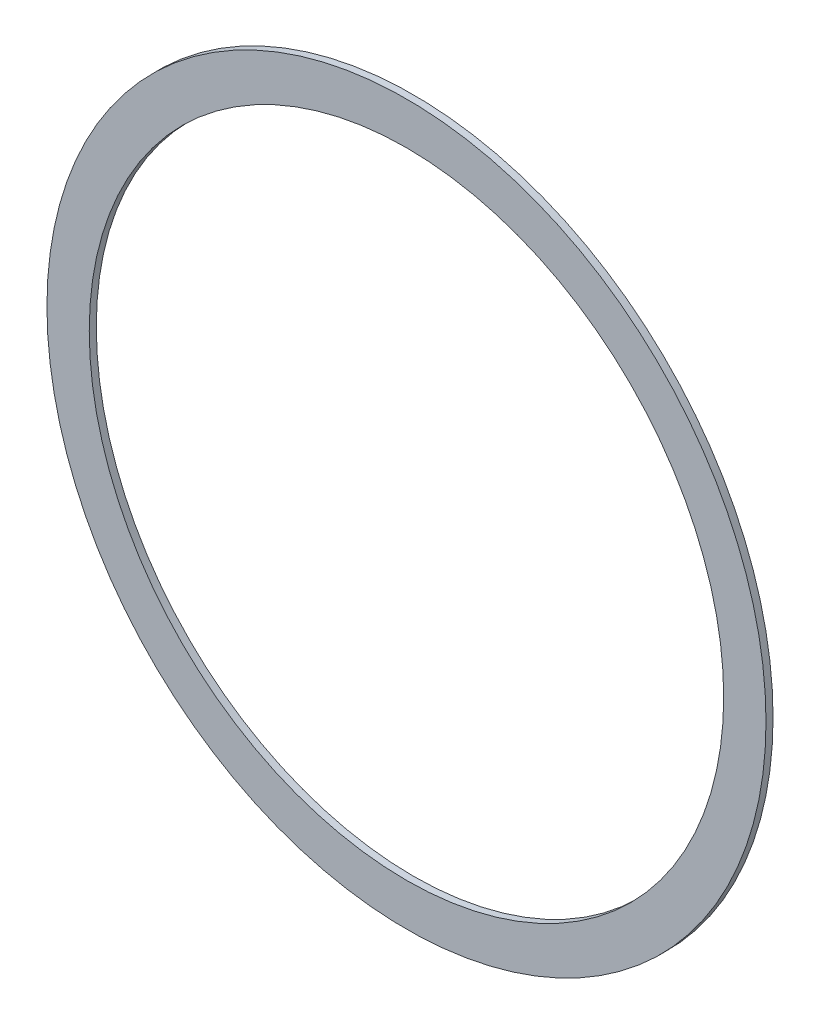
ISO-10303-21;
HEADER;
FILE_DESCRIPTION(('STEP AP214'),'2;1');
FILE_NAME('part.step','',(''),(''),'','','');
FILE_SCHEMA(('AUTOMOTIVE_DESIGN { 1 0 10303 214 1 1 1 1 }'));
ENDSEC;
DATA;
#1=APPLICATION_CONTEXT('core data for automotive mechanical design processes');
#2=APPLICATION_PROTOCOL_DEFINITION('international standard','automotive_design',2000,#1);
#3=PRODUCT_CONTEXT('',#1,'mechanical');
#4=PRODUCT('Part','Part','',(#3));
#5=PRODUCT_RELATED_PRODUCT_CATEGORY('part','',(#4));
#6=PRODUCT_DEFINITION_FORMATION('','',#4);
#7=PRODUCT_DEFINITION_CONTEXT('part definition',#1,'design');
#8=PRODUCT_DEFINITION('design','',#6,#7);
#9=PRODUCT_DEFINITION_SHAPE('','',#8);
#10=(LENGTH_UNIT() NAMED_UNIT(*) SI_UNIT(.MILLI.,.METRE.));
#11=(NAMED_UNIT(*) PLANE_ANGLE_UNIT() SI_UNIT($,.RADIAN.));
#12=(NAMED_UNIT(*) SI_UNIT($,.STERADIAN.) SOLID_ANGLE_UNIT());
#13=UNCERTAINTY_MEASURE_WITH_UNIT(LENGTH_MEASURE(1.E-05),#10,'distance_accuracy_value','');
#14=(GEOMETRIC_REPRESENTATION_CONTEXT(3) GLOBAL_UNCERTAINTY_ASSIGNED_CONTEXT((#13)) GLOBAL_UNIT_ASSIGNED_CONTEXT((#10,
#11,#12)) REPRESENTATION_CONTEXT('',''));
#15=CARTESIAN_POINT('',(0.,0.,0.));
#16=DIRECTION('',(0.,0.,1.));
#17=DIRECTION('',(1.,0.,0.));
#18=AXIS2_PLACEMENT_3D('',#15,#16,#17);
#19=CARTESIAN_POINT('',(0.,0.,0.));
#20=DIRECTION('',(0.,0.,1.));
#21=DIRECTION('',(1.,0.,0.));
#22=AXIS2_PLACEMENT_3D('',#19,#20,#21);
#23=CYLINDRICAL_SURFACE('',#22,22.5);
#24=DIRECTION('',(0.,0.,1.));
#25=VECTOR('',#24,1.);
#26=CARTESIAN_POINT('',(22.5,0.,0.));
#27=LINE('',#26,#25);
#28=CARTESIAN_POINT('',(22.5,0.,0.));
#29=VERTEX_POINT('',#28);
#30=CARTESIAN_POINT('',(22.5,0.,0.5));
#31=VERTEX_POINT('',#30);
#32=EDGE_CURVE('E9',#29,#31,#27,.T.);
#33=ORIENTED_EDGE('',*,*,#32,.F.);
#34=CARTESIAN_POINT('',(0.,0.,0.));
#35=DIRECTION('',(0.,0.,1.));
#36=DIRECTION('',(1.,0.,0.));
#37=AXIS2_PLACEMENT_3D('',#34,#35,#36);
#38=CIRCLE('',#37,22.5);
#39=EDGE_CURVE('E18',#29,#29,#38,.T.);
#40=ORIENTED_EDGE('',*,*,#39,.F.);
#41=ORIENTED_EDGE('',*,*,#32,.T.);
#42=CARTESIAN_POINT('',(0.,0.,0.5));
#43=DIRECTION('',(0.,0.,1.));
#44=DIRECTION('',(1.,0.,0.));
#45=AXIS2_PLACEMENT_3D('',#42,#43,#44);
#46=CIRCLE('',#45,22.5);
#47=EDGE_CURVE('E65',#31,#31,#46,.T.);
#48=ORIENTED_EDGE('',*,*,#47,.T.);
#49=EDGE_LOOP('',(#33,#40,#41,#48));
#50=FACE_BOUND('',#49,.T.);
#51=ADVANCED_FACE('F15',(#50),#23,.F.);
#52=CARTESIAN_POINT('',(0.,0.,0.));
#53=DIRECTION('',(0.,0.,1.));
#54=DIRECTION('',(1.,0.,0.));
#55=AXIS2_PLACEMENT_3D('',#52,#53,#54);
#56=PLANE('',#55);
#57=ORIENTED_EDGE('',*,*,#39,.T.);
#58=EDGE_LOOP('',(#57));
#59=FACE_BOUND('',#58,.T.);
#60=CARTESIAN_POINT('',(0.,0.,0.));
#61=DIRECTION('',(0.,0.,1.));
#62=DIRECTION('',(1.,0.,0.));
#63=AXIS2_PLACEMENT_3D('',#60,#61,#62);
#64=CIRCLE('',#63,25.5);
#65=CARTESIAN_POINT('',(25.5,0.,0.));
#66=VERTEX_POINT('',#65);
#67=EDGE_CURVE('E54',#66,#66,#64,.T.);
#68=ORIENTED_EDGE('',*,*,#67,.F.);
#69=EDGE_LOOP('',(#68));
#70=FACE_BOUND('',#69,.T.);
#71=ADVANCED_FACE('F72',(#59,#70),#56,.F.);
#72=CARTESIAN_POINT('',(0.,0.,0.5));
#73=DIRECTION('',(0.,0.,1.));
#74=DIRECTION('',(1.,0.,0.));
#75=AXIS2_PLACEMENT_3D('',#72,#73,#74);
#76=PLANE('',#75);
#77=ORIENTED_EDGE('',*,*,#47,.F.);
#78=EDGE_LOOP('',(#77));
#79=FACE_BOUND('',#78,.T.);
#80=CARTESIAN_POINT('',(0.,0.,0.5));
#81=DIRECTION('',(0.,0.,1.));
#82=DIRECTION('',(1.,0.,0.));
#83=AXIS2_PLACEMENT_3D('',#80,#81,#82);
#84=CIRCLE('',#83,25.5);
#85=CARTESIAN_POINT('',(25.5,0.,0.5));
#86=VERTEX_POINT('',#85);
#87=EDGE_CURVE('E52',#86,#86,#84,.T.);
#88=ORIENTED_EDGE('',*,*,#87,.T.);
#89=EDGE_LOOP('',(#88));
#90=FACE_BOUND('',#89,.T.);
#91=ADVANCED_FACE('F56',(#79,#90),#76,.T.);
#92=CARTESIAN_POINT('',(0.,0.,0.));
#93=DIRECTION('',(0.,0.,1.));
#94=DIRECTION('',(1.,0.,0.));
#95=AXIS2_PLACEMENT_3D('',#92,#93,#94);
#96=CYLINDRICAL_SURFACE('',#95,25.5);
#97=ORIENTED_EDGE('',*,*,#87,.F.);
#98=DIRECTION('',(0.,0.,1.));
#99=VECTOR('',#98,1.);
#100=CARTESIAN_POINT('',(25.5,0.,0.));
#101=LINE('',#100,#99);
#102=EDGE_CURVE('E49',#66,#86,#101,.T.);
#103=ORIENTED_EDGE('',*,*,#102,.F.);
#104=ORIENTED_EDGE('',*,*,#67,.T.);
#105=ORIENTED_EDGE('',*,*,#102,.T.);
#106=EDGE_LOOP('',(#97,#103,#104,#105));
#107=FACE_BOUND('',#106,.T.);
#108=ADVANCED_FACE('F55',(#107),#96,.T.);
#109=CLOSED_SHELL('',(#51,#71,#91,#108));
#110=MANIFOLD_SOLID_BREP('B1',#109);
#111=ADVANCED_BREP_SHAPE_REPRESENTATION('',(#18,#110),#14);
#112=SHAPE_DEFINITION_REPRESENTATION(#9,#111);
ENDSEC;
END-ISO-10303-21;
